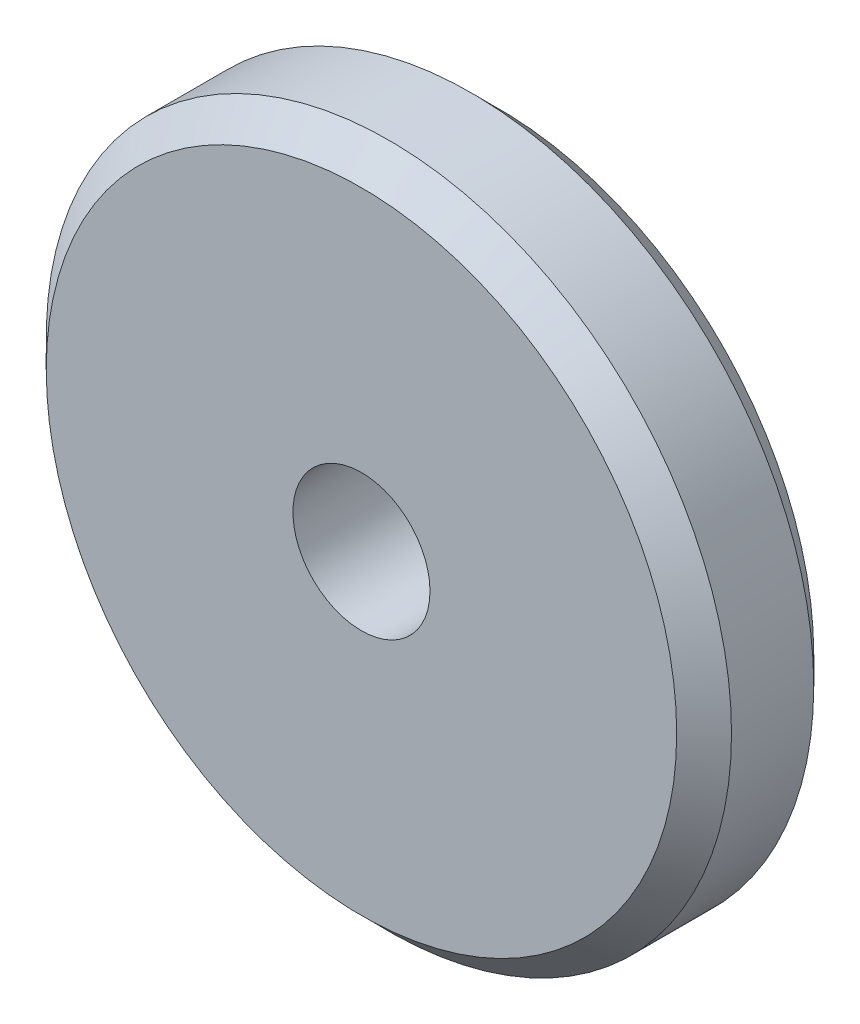
ISO-10303-21;
HEADER;
FILE_DESCRIPTION(('STEP AP214'),'2;1');
FILE_NAME('part.step','',(''),(''),'','','');
FILE_SCHEMA(('AUTOMOTIVE_DESIGN { 1 0 10303 214 1 1 1 1 }'));
ENDSEC;
DATA;
#1=APPLICATION_CONTEXT('core data for automotive mechanical design processes');
#2=APPLICATION_PROTOCOL_DEFINITION('international standard','automotive_design',2000,#1);
#3=PRODUCT_CONTEXT('',#1,'mechanical');
#4=PRODUCT('Part','Part','',(#3));
#5=PRODUCT_RELATED_PRODUCT_CATEGORY('part','',(#4));
#6=PRODUCT_DEFINITION_FORMATION('','',#4);
#7=PRODUCT_DEFINITION_CONTEXT('part definition',#1,'design');
#8=PRODUCT_DEFINITION('design','',#6,#7);
#9=PRODUCT_DEFINITION_SHAPE('','',#8);
#10=(LENGTH_UNIT() NAMED_UNIT(*) SI_UNIT(.MILLI.,.METRE.));
#11=(NAMED_UNIT(*) PLANE_ANGLE_UNIT() SI_UNIT($,.RADIAN.));
#12=(NAMED_UNIT(*) SI_UNIT($,.STERADIAN.) SOLID_ANGLE_UNIT());
#13=UNCERTAINTY_MEASURE_WITH_UNIT(LENGTH_MEASURE(1.E-05),#10,'distance_accuracy_value','');
#14=(GEOMETRIC_REPRESENTATION_CONTEXT(3) GLOBAL_UNCERTAINTY_ASSIGNED_CONTEXT((#13)) GLOBAL_UNIT_ASSIGNED_CONTEXT((#10,
#11,#12)) REPRESENTATION_CONTEXT('',''));
#15=CARTESIAN_POINT('',(0.,0.,0.));
#16=DIRECTION('',(0.,0.,1.));
#17=DIRECTION('',(1.,0.,0.));
#18=AXIS2_PLACEMENT_3D('',#15,#16,#17);
#19=CARTESIAN_POINT('',(0.,0.,10.));
#20=DIRECTION('',(0.,0.,1.));
#21=DIRECTION('',(1.,0.,0.));
#22=AXIS2_PLACEMENT_3D('',#19,#20,#21);
#23=PLANE('',#22);
#24=CARTESIAN_POINT('',(0.,0.,10.));
#25=DIRECTION('',(0.,0.,1.));
#26=DIRECTION('',(1.,0.,0.));
#27=AXIS2_PLACEMENT_3D('',#24,#25,#26);
#28=CIRCLE('',#27,23.);
#29=CARTESIAN_POINT('',(23.,0.,10.));
#30=VERTEX_POINT('',#29);
#31=EDGE_CURVE('E10',#30,#30,#28,.T.);
#32=ORIENTED_EDGE('',*,*,#31,.T.);
#33=EDGE_LOOP('',(#32));
#34=FACE_BOUND('',#33,.T.);
#35=CARTESIAN_POINT('',(0.,0.,10.));
#36=DIRECTION('',(0.,0.,1.));
#37=DIRECTION('',(1.,0.,0.));
#38=AXIS2_PLACEMENT_3D('',#35,#36,#37);
#39=CIRCLE('',#38,5.);
#40=CARTESIAN_POINT('',(5.,0.,10.));
#41=VERTEX_POINT('',#40);
#42=EDGE_CURVE('E58',#41,#41,#39,.T.);
#43=ORIENTED_EDGE('',*,*,#42,.F.);
#44=EDGE_LOOP('',(#43));
#45=FACE_BOUND('',#44,.T.);
#46=ADVANCED_FACE('F37',(#34,#45),#23,.T.);
#47=CARTESIAN_POINT('',(0.,0.,0.));
#48=DIRECTION('',(0.,0.,1.));
#49=DIRECTION('',(1.,0.,0.));
#50=AXIS2_PLACEMENT_3D('',#47,#48,#49);
#51=PLANE('',#50);
#52=CARTESIAN_POINT('',(0.,0.,0.));
#53=DIRECTION('',(0.,0.,1.));
#54=DIRECTION('',(1.,0.,0.));
#55=AXIS2_PLACEMENT_3D('',#52,#53,#54);
#56=CIRCLE('',#55,23.);
#57=CARTESIAN_POINT('',(23.,0.,0.));
#58=VERTEX_POINT('',#57);
#59=EDGE_CURVE('E45',#58,#58,#56,.F.);
#60=ORIENTED_EDGE('',*,*,#59,.T.);
#61=EDGE_LOOP('',(#60));
#62=FACE_BOUND('',#61,.T.);
#63=CARTESIAN_POINT('',(0.,0.,0.));
#64=DIRECTION('',(0.,0.,1.));
#65=DIRECTION('',(1.,0.,0.));
#66=AXIS2_PLACEMENT_3D('',#63,#64,#65);
#67=CIRCLE('',#66,5.);
#68=CARTESIAN_POINT('',(5.,0.,0.));
#69=VERTEX_POINT('',#68);
#70=EDGE_CURVE('E59',#69,#69,#67,.T.);
#71=ORIENTED_EDGE('',*,*,#70,.T.);
#72=EDGE_LOOP('',(#71));
#73=FACE_BOUND('',#72,.T.);
#74=ADVANCED_FACE('F69',(#62,#73),#51,.F.);
#75=CARTESIAN_POINT('',(0.,0.,10.));
#76=DIRECTION('',(0.,0.,-1.));
#77=DIRECTION('',(-1.,0.,0.));
#78=AXIS2_PLACEMENT_3D('',#75,#76,#77);
#79=CYLINDRICAL_SURFACE('',#78,25.);
#80=CARTESIAN_POINT('',(0.,0.,2.));
#81=DIRECTION('',(0.,0.,1.));
#82=DIRECTION('',(1.,0.,0.));
#83=AXIS2_PLACEMENT_3D('',#80,#81,#82);
#84=CIRCLE('',#83,25.);
#85=CARTESIAN_POINT('',(25.,0.,2.));
#86=VERTEX_POINT('',#85);
#87=EDGE_CURVE('E49',#86,#86,#84,.T.);
#88=ORIENTED_EDGE('',*,*,#87,.T.);
#89=EDGE_LOOP('',(#88));
#90=FACE_BOUND('',#89,.T.);
#91=CARTESIAN_POINT('',(0.,0.,8.00000000000001));
#92=DIRECTION('',(0.,0.,1.));
#93=DIRECTION('',(1.,0.,0.));
#94=AXIS2_PLACEMENT_3D('',#91,#92,#93);
#95=CIRCLE('',#94,25.);
#96=CARTESIAN_POINT('',(25.,0.,8.00000000000001));
#97=VERTEX_POINT('',#96);
#98=EDGE_CURVE('E53',#97,#97,#95,.F.);
#99=ORIENTED_EDGE('',*,*,#98,.T.);
#100=EDGE_LOOP('',(#99));
#101=FACE_BOUND('',#100,.T.);
#102=ADVANCED_FACE('F74',(#90,#101),#79,.T.);
#103=CARTESIAN_POINT('',(0.,0.,10.));
#104=DIRECTION('',(0.,0.,-1.));
#105=DIRECTION('',(-1.,0.,0.));
#106=AXIS2_PLACEMENT_3D('',#103,#104,#105);
#107=CYLINDRICAL_SURFACE('',#106,5.);
#108=ORIENTED_EDGE('',*,*,#42,.T.);
#109=EDGE_LOOP('',(#108));
#110=FACE_BOUND('',#109,.T.);
#111=ORIENTED_EDGE('',*,*,#70,.F.);
#112=EDGE_LOOP('',(#111));
#113=FACE_BOUND('',#112,.T.);
#114=ADVANCED_FACE('F65',(#110,#113),#107,.F.);
#115=CARTESIAN_POINT('',(0.,0.,2.));
#116=DIRECTION('',(0.,0.,1.));
#117=DIRECTION('',(1.,0.,0.));
#118=AXIS2_PLACEMENT_3D('',#115,#116,#117);
#119=CONICAL_SURFACE('',#118,25.,0.78539816339745);
#120=ORIENTED_EDGE('',*,*,#59,.F.);
#121=EDGE_LOOP('',(#120));
#122=FACE_BOUND('',#121,.T.);
#123=ORIENTED_EDGE('',*,*,#87,.F.);
#124=EDGE_LOOP('',(#123));
#125=FACE_BOUND('',#124,.T.);
#126=ADVANCED_FACE('F81',(#122,#125),#119,.T.);
#127=CARTESIAN_POINT('',(0.,0.,10.));
#128=DIRECTION('',(0.,0.,-1.));
#129=DIRECTION('',(-1.,0.,0.));
#130=AXIS2_PLACEMENT_3D('',#127,#128,#129);
#131=CONICAL_SURFACE('',#130,23.,0.785398163397447);
#132=ORIENTED_EDGE('',*,*,#98,.F.);
#133=EDGE_LOOP('',(#132));
#134=FACE_BOUND('',#133,.T.);
#135=ORIENTED_EDGE('',*,*,#31,.F.);
#136=EDGE_LOOP('',(#135));
#137=FACE_BOUND('',#136,.T.);
#138=ADVANCED_FACE('F40',(#134,#137),#131,.T.);
#139=CLOSED_SHELL('',(#46,#74,#102,#114,#126,#138));
#140=MANIFOLD_SOLID_BREP('B2',#139);
#141=ADVANCED_BREP_SHAPE_REPRESENTATION('',(#18,#140),#14);
#142=SHAPE_DEFINITION_REPRESENTATION(#9,#141);
ENDSEC;
END-ISO-10303-21;
